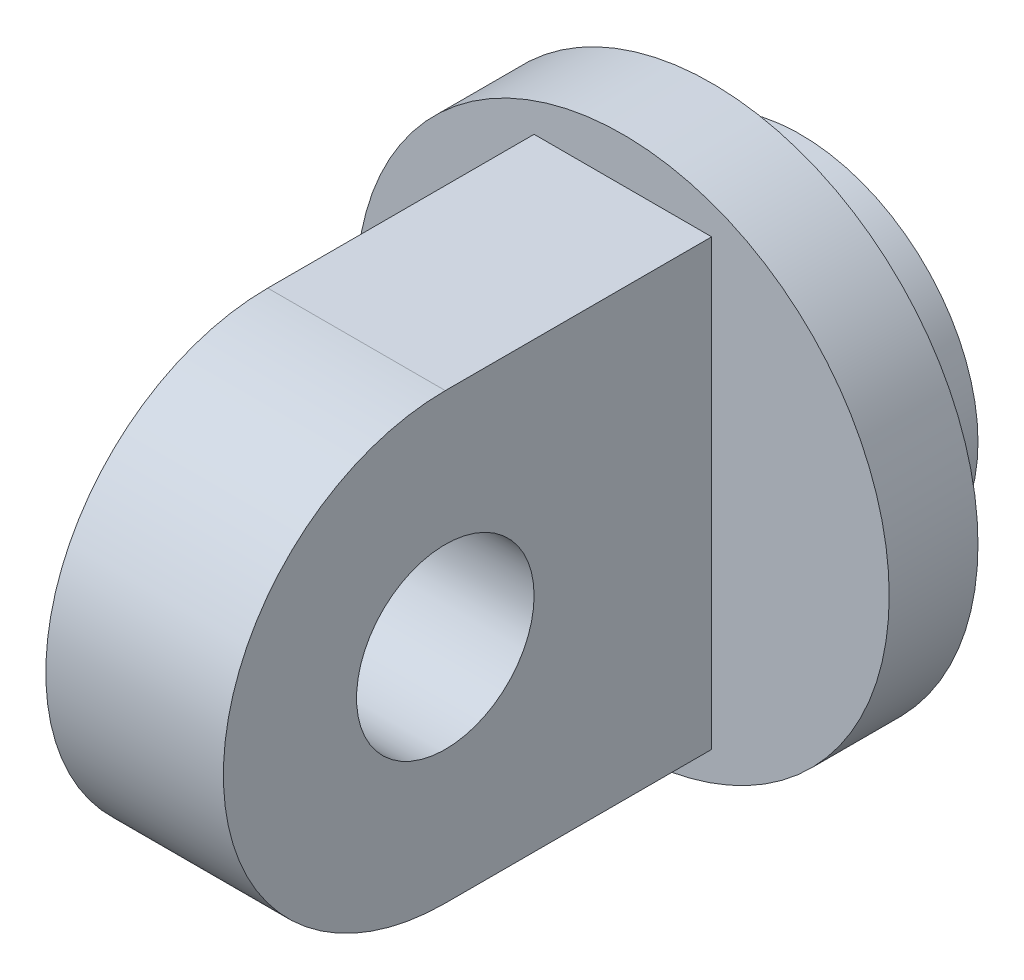
ISO-10303-21;
HEADER;
FILE_DESCRIPTION(('STEP AP214'),'2;1');
FILE_NAME('part.step','',(''),(''),'','','');
FILE_SCHEMA(('AUTOMOTIVE_DESIGN { 1 0 10303 214 1 1 1 1 }'));
ENDSEC;
DATA;
#1=APPLICATION_CONTEXT('core data for automotive mechanical design processes');
#2=APPLICATION_PROTOCOL_DEFINITION('international standard','automotive_design',2000,#1);
#3=PRODUCT_CONTEXT('',#1,'mechanical');
#4=PRODUCT('Part','Part','',(#3));
#5=PRODUCT_RELATED_PRODUCT_CATEGORY('part','',(#4));
#6=PRODUCT_DEFINITION_FORMATION('','',#4);
#7=PRODUCT_DEFINITION_CONTEXT('part definition',#1,'design');
#8=PRODUCT_DEFINITION('design','',#6,#7);
#9=PRODUCT_DEFINITION_SHAPE('','',#8);
#10=(LENGTH_UNIT() NAMED_UNIT(*) SI_UNIT(.MILLI.,.METRE.));
#11=(NAMED_UNIT(*) PLANE_ANGLE_UNIT() SI_UNIT($,.RADIAN.));
#12=(NAMED_UNIT(*) SI_UNIT($,.STERADIAN.) SOLID_ANGLE_UNIT());
#13=UNCERTAINTY_MEASURE_WITH_UNIT(LENGTH_MEASURE(1.E-05),#10,'distance_accuracy_value','');
#14=(GEOMETRIC_REPRESENTATION_CONTEXT(3) GLOBAL_UNCERTAINTY_ASSIGNED_CONTEXT((#13)) GLOBAL_UNIT_ASSIGNED_CONTEXT((#10,
#11,#12)) REPRESENTATION_CONTEXT('',''));
#15=CARTESIAN_POINT('',(0.,0.,0.));
#16=DIRECTION('',(0.,0.,1.));
#17=DIRECTION('',(1.,0.,0.));
#18=AXIS2_PLACEMENT_3D('',#15,#16,#17);
#19=CARTESIAN_POINT('',(0.,0.,500.));
#20=DIRECTION('',(0.,0.,1.));
#21=DIRECTION('',(1.,0.,0.));
#22=AXIS2_PLACEMENT_3D('',#19,#20,#21);
#23=PLANE('',#22);
#24=CARTESIAN_POINT('',(0.,0.,500.));
#25=DIRECTION('',(0.,0.,1.));
#26=DIRECTION('',(1.,0.,0.));
#27=AXIS2_PLACEMENT_3D('',#24,#25,#26);
#28=CIRCLE('',#27,750.);
#29=CARTESIAN_POINT('',(750.,0.,500.));
#30=VERTEX_POINT('',#29);
#31=EDGE_CURVE('E95',#30,#30,#28,.T.);
#32=ORIENTED_EDGE('',*,*,#31,.T.);
#33=EDGE_LOOP('',(#32));
#34=FACE_BOUND('',#33,.T.);
#35=DIRECTION('',(0.,1.,0.));
#36=VECTOR('',#35,1.);
#37=CARTESIAN_POINT('',(250.,625.,500.));
#38=LINE('',#37,#36);
#39=CARTESIAN_POINT('',(250.,-625.,500.));
#40=VERTEX_POINT('',#39);
#41=CARTESIAN_POINT('',(250.,625.,500.));
#42=VERTEX_POINT('',#41);
#43=EDGE_CURVE('E81',#40,#42,#38,.T.);
#44=ORIENTED_EDGE('',*,*,#43,.F.);
#45=DIRECTION('',(-1.,0.,0.));
#46=VECTOR('',#45,1.);
#47=CARTESIAN_POINT('',(250.,-625.,500.));
#48=LINE('',#47,#46);
#49=CARTESIAN_POINT('',(-250.,-625.,500.));
#50=VERTEX_POINT('',#49);
#51=EDGE_CURVE('E79',#40,#50,#48,.T.);
#52=ORIENTED_EDGE('',*,*,#51,.T.);
#53=DIRECTION('',(0.,1.,0.));
#54=VECTOR('',#53,1.);
#55=CARTESIAN_POINT('',(-250.,625.,500.));
#56=LINE('',#55,#54);
#57=CARTESIAN_POINT('',(-250.,625.,500.));
#58=VERTEX_POINT('',#57);
#59=EDGE_CURVE('E244',#50,#58,#56,.T.);
#60=ORIENTED_EDGE('',*,*,#59,.T.);
#61=DIRECTION('',(-1.,0.,0.));
#62=VECTOR('',#61,1.);
#63=CARTESIAN_POINT('',(250.,625.,500.));
#64=LINE('',#63,#62);
#65=EDGE_CURVE('E97',#42,#58,#64,.T.);
#66=ORIENTED_EDGE('',*,*,#65,.F.);
#67=EDGE_LOOP('',(#44,#52,#60,#66));
#68=FACE_BOUND('',#67,.T.);
#69=ADVANCED_FACE('F31',(#34,#68),#23,.T.);
#70=CARTESIAN_POINT('',(0.,0.,250.));
#71=DIRECTION('',(0.,0.,-1.));
#72=DIRECTION('',(-1.,0.,0.));
#73=AXIS2_PLACEMENT_3D('',#70,#71,#72);
#74=CYLINDRICAL_SURFACE('',#73,500.);
#75=CARTESIAN_POINT('',(0.,0.,250.));
#76=DIRECTION('',(0.,0.,1.));
#77=DIRECTION('',(1.,0.,0.));
#78=AXIS2_PLACEMENT_3D('',#75,#76,#77);
#79=CIRCLE('',#78,500.);
#80=CARTESIAN_POINT('',(500.,0.,250.));
#81=VERTEX_POINT('',#80);
#82=EDGE_CURVE('E11',#81,#81,#79,.T.);
#83=ORIENTED_EDGE('',*,*,#82,.F.);
#84=EDGE_LOOP('',(#83));
#85=FACE_BOUND('',#84,.T.);
#86=CARTESIAN_POINT('',(0.,0.,0.));
#87=DIRECTION('',(0.,0.,1.));
#88=DIRECTION('',(1.,0.,0.));
#89=AXIS2_PLACEMENT_3D('',#86,#87,#88);
#90=CIRCLE('',#89,500.);
#91=CARTESIAN_POINT('',(500.,0.,0.));
#92=VERTEX_POINT('',#91);
#93=EDGE_CURVE('E35',#92,#92,#90,.T.);
#94=ORIENTED_EDGE('',*,*,#93,.T.);
#95=EDGE_LOOP('',(#94));
#96=FACE_BOUND('',#95,.T.);
#97=ADVANCED_FACE('F33',(#85,#96),#74,.T.);
#98=CARTESIAN_POINT('',(0.,0.,0.));
#99=DIRECTION('',(0.,0.,1.));
#100=DIRECTION('',(1.,0.,0.));
#101=AXIS2_PLACEMENT_3D('',#98,#99,#100);
#102=PLANE('',#101);
#103=CARTESIAN_POINT('',(0.,0.,0.));
#104=DIRECTION('',(0.,0.,-1.));
#105=DIRECTION('',(-1.,0.,0.));
#106=AXIS2_PLACEMENT_3D('',#103,#104,#105);
#107=CIRCLE('',#106,125.);
#108=CARTESIAN_POINT('',(-125.,0.,0.));
#109=VERTEX_POINT('',#108);
#110=EDGE_CURVE('E102',#109,#109,#107,.T.);
#111=ORIENTED_EDGE('',*,*,#110,.F.);
#112=EDGE_LOOP('',(#111));
#113=FACE_BOUND('',#112,.T.);
#114=ORIENTED_EDGE('',*,*,#93,.F.);
#115=EDGE_LOOP('',(#114));
#116=FACE_BOUND('',#115,.T.);
#117=ADVANCED_FACE('F112',(#113,#116),#102,.F.);
#118=CARTESIAN_POINT('',(0.,0.,100.));
#119=DIRECTION('',(0.,0.,-1.));
#120=DIRECTION('',(-1.,0.,0.));
#121=AXIS2_PLACEMENT_3D('',#118,#119,#120);
#122=CYLINDRICAL_SURFACE('',#121,125.);
#123=CARTESIAN_POINT('',(0.,0.,100.));
#124=DIRECTION('',(0.,0.,-1.));
#125=DIRECTION('',(-1.,0.,0.));
#126=AXIS2_PLACEMENT_3D('',#123,#124,#125);
#127=CIRCLE('',#126,125.);
#128=CARTESIAN_POINT('',(-125.,0.,100.));
#129=VERTEX_POINT('',#128);
#130=EDGE_CURVE('E104',#129,#129,#127,.T.);
#131=ORIENTED_EDGE('',*,*,#130,.F.);
#132=EDGE_LOOP('',(#131));
#133=FACE_BOUND('',#132,.T.);
#134=ORIENTED_EDGE('',*,*,#110,.T.);
#135=EDGE_LOOP('',(#134));
#136=FACE_BOUND('',#135,.T.);
#137=ADVANCED_FACE('F110',(#133,#136),#122,.F.);
#138=CARTESIAN_POINT('',(0.,0.,100.));
#139=DIRECTION('',(0.,0.,-1.));
#140=DIRECTION('',(-1.,0.,0.));
#141=AXIS2_PLACEMENT_3D('',#138,#139,#140);
#142=PLANE('',#141);
#143=ORIENTED_EDGE('',*,*,#130,.T.);
#144=EDGE_LOOP('',(#143));
#145=FACE_BOUND('',#144,.T.);
#146=ADVANCED_FACE('F130',(#145),#142,.T.);
#147=CARTESIAN_POINT('',(0.,0.,250.));
#148=DIRECTION('',(0.,0.,1.));
#149=DIRECTION('',(1.,0.,0.));
#150=AXIS2_PLACEMENT_3D('',#147,#148,#149);
#151=PLANE('',#150);
#152=CARTESIAN_POINT('',(0.,0.,250.));
#153=DIRECTION('',(0.,0.,1.));
#154=DIRECTION('',(1.,0.,0.));
#155=AXIS2_PLACEMENT_3D('',#152,#153,#154);
#156=CIRCLE('',#155,750.);
#157=CARTESIAN_POINT('',(750.,0.,250.));
#158=VERTEX_POINT('',#157);
#159=EDGE_CURVE('E92',#158,#158,#156,.T.);
#160=ORIENTED_EDGE('',*,*,#159,.F.);
#161=EDGE_LOOP('',(#160));
#162=FACE_BOUND('',#161,.T.);
#163=ORIENTED_EDGE('',*,*,#82,.T.);
#164=EDGE_LOOP('',(#163));
#165=FACE_BOUND('',#164,.T.);
#166=ADVANCED_FACE('F127',(#162,#165),#151,.F.);
#167=CARTESIAN_POINT('',(0.,0.,500.));
#168=DIRECTION('',(0.,0.,-1.));
#169=DIRECTION('',(-1.,0.,0.));
#170=AXIS2_PLACEMENT_3D('',#167,#168,#169);
#171=CYLINDRICAL_SURFACE('',#170,750.);
#172=ORIENTED_EDGE('',*,*,#31,.F.);
#173=EDGE_LOOP('',(#172));
#174=FACE_BOUND('',#173,.T.);
#175=ORIENTED_EDGE('',*,*,#159,.T.);
#176=EDGE_LOOP('',(#175));
#177=FACE_BOUND('',#176,.T.);
#178=ADVANCED_FACE('F129',(#174,#177),#171,.T.);
#179=CARTESIAN_POINT('',(250.,-1.11022302462516E-13,1250.));
#180=DIRECTION('',(1.,0.,0.));
#181=DIRECTION('',(0.,0.,-1.));
#182=AXIS2_PLACEMENT_3D('',#179,#180,#181);
#183=PLANE('',#182);
#184=CARTESIAN_POINT('',(250.,-1.11022302462516E-13,1250.));
#185=DIRECTION('',(1.,0.,0.));
#186=DIRECTION('',(0.,0.,-1.));
#187=AXIS2_PLACEMENT_3D('',#184,#185,#186);
#188=CIRCLE('',#187,625.);
#189=CARTESIAN_POINT('',(250.,625.,1250.));
#190=VERTEX_POINT('',#189);
#191=CARTESIAN_POINT('',(250.,-625.,1250.));
#192=VERTEX_POINT('',#191);
#193=EDGE_CURVE('E82',#190,#192,#188,.T.);
#194=ORIENTED_EDGE('',*,*,#193,.T.);
#195=DIRECTION('',(0.,0.,-1.));
#196=VECTOR('',#195,1.);
#197=CARTESIAN_POINT('',(250.,-625.,500.));
#198=LINE('',#197,#196);
#199=EDGE_CURVE('E73',#192,#40,#198,.T.);
#200=ORIENTED_EDGE('',*,*,#199,.T.);
#201=ORIENTED_EDGE('',*,*,#43,.T.);
#202=DIRECTION('',(0.,0.,1.));
#203=VECTOR('',#202,1.);
#204=CARTESIAN_POINT('',(250.,625.,1250.));
#205=LINE('',#204,#203);
#206=EDGE_CURVE('E46',#42,#190,#205,.T.);
#207=ORIENTED_EDGE('',*,*,#206,.T.);
#208=EDGE_LOOP('',(#194,#200,#201,#207));
#209=FACE_BOUND('',#208,.T.);
#210=CARTESIAN_POINT('',(250.,-1.11022302462516E-13,1250.));
#211=DIRECTION('',(1.,0.,0.));
#212=DIRECTION('',(0.,0.,-1.));
#213=AXIS2_PLACEMENT_3D('',#210,#211,#212);
#214=CIRCLE('',#213,250.);
#215=CARTESIAN_POINT('',(250.,-1.11022302462516E-13,1000.));
#216=VERTEX_POINT('',#215);
#217=EDGE_CURVE('E230',#216,#216,#214,.T.);
#218=ORIENTED_EDGE('',*,*,#217,.F.);
#219=EDGE_LOOP('',(#218));
#220=FACE_BOUND('',#219,.T.);
#221=ADVANCED_FACE('F85',(#209,#220),#183,.T.);
#222=CARTESIAN_POINT('',(-250.,-1.11022302462516E-13,1250.));
#223=DIRECTION('',(1.,0.,0.));
#224=DIRECTION('',(0.,0.,-1.));
#225=AXIS2_PLACEMENT_3D('',#222,#223,#224);
#226=PLANE('',#225);
#227=CARTESIAN_POINT('',(-250.,-1.11022302462516E-13,1250.));
#228=DIRECTION('',(1.,0.,0.));
#229=DIRECTION('',(0.,0.,-1.));
#230=AXIS2_PLACEMENT_3D('',#227,#228,#229);
#231=CIRCLE('',#230,625.);
#232=CARTESIAN_POINT('',(-250.,625.,1250.));
#233=VERTEX_POINT('',#232);
#234=CARTESIAN_POINT('',(-250.,-625.,1250.));
#235=VERTEX_POINT('',#234);
#236=EDGE_CURVE('E91',#233,#235,#231,.T.);
#237=ORIENTED_EDGE('',*,*,#236,.F.);
#238=DIRECTION('',(0.,0.,1.));
#239=VECTOR('',#238,1.);
#240=CARTESIAN_POINT('',(-250.,625.,1250.));
#241=LINE('',#240,#239);
#242=EDGE_CURVE('E67',#58,#233,#241,.T.);
#243=ORIENTED_EDGE('',*,*,#242,.F.);
#244=ORIENTED_EDGE('',*,*,#59,.F.);
#245=DIRECTION('',(0.,0.,-1.));
#246=VECTOR('',#245,1.);
#247=CARTESIAN_POINT('',(-250.,-625.,500.));
#248=LINE('',#247,#246);
#249=EDGE_CURVE('E242',#235,#50,#248,.T.);
#250=ORIENTED_EDGE('',*,*,#249,.F.);
#251=EDGE_LOOP('',(#237,#243,#244,#250));
#252=FACE_BOUND('',#251,.T.);
#253=CARTESIAN_POINT('',(-250.,-1.11022302462516E-13,1250.));
#254=DIRECTION('',(1.,0.,0.));
#255=DIRECTION('',(0.,0.,-1.));
#256=AXIS2_PLACEMENT_3D('',#253,#254,#255);
#257=CIRCLE('',#256,250.);
#258=CARTESIAN_POINT('',(-250.,-1.11022302462516E-13,1000.));
#259=VERTEX_POINT('',#258);
#260=EDGE_CURVE('E233',#259,#259,#257,.T.);
#261=ORIENTED_EDGE('',*,*,#260,.T.);
#262=EDGE_LOOP('',(#261));
#263=FACE_BOUND('',#262,.T.);
#264=ADVANCED_FACE('F180',(#252,#263),#226,.F.);
#265=CARTESIAN_POINT('',(250.,-1.11022302462516E-13,1250.));
#266=DIRECTION('',(-1.,0.,0.));
#267=DIRECTION('',(0.,0.,1.));
#268=AXIS2_PLACEMENT_3D('',#265,#266,#267);
#269=CYLINDRICAL_SURFACE('',#268,625.);
#270=ORIENTED_EDGE('',*,*,#236,.T.);
#271=DIRECTION('',(-1.,0.,0.));
#272=VECTOR('',#271,1.);
#273=CARTESIAN_POINT('',(250.,-625.,1250.));
#274=LINE('',#273,#272);
#275=EDGE_CURVE('E76',#192,#235,#274,.T.);
#276=ORIENTED_EDGE('',*,*,#275,.F.);
#277=ORIENTED_EDGE('',*,*,#193,.F.);
#278=DIRECTION('',(-1.,0.,0.));
#279=VECTOR('',#278,1.);
#280=CARTESIAN_POINT('',(250.,625.,1250.));
#281=LINE('',#280,#279);
#282=EDGE_CURVE('E240',#190,#233,#281,.T.);
#283=ORIENTED_EDGE('',*,*,#282,.T.);
#284=EDGE_LOOP('',(#270,#276,#277,#283));
#285=FACE_BOUND('',#284,.T.);
#286=ADVANCED_FACE('F89',(#285),#269,.T.);
#287=CARTESIAN_POINT('',(250.,-625.,500.));
#288=DIRECTION('',(0.,1.,0.));
#289=DIRECTION('',(0.,0.,1.));
#290=AXIS2_PLACEMENT_3D('',#287,#288,#289);
#291=PLANE('',#290);
#292=ORIENTED_EDGE('',*,*,#249,.T.);
#293=ORIENTED_EDGE('',*,*,#51,.F.);
#294=ORIENTED_EDGE('',*,*,#199,.F.);
#295=ORIENTED_EDGE('',*,*,#275,.T.);
#296=EDGE_LOOP('',(#292,#293,#294,#295));
#297=FACE_BOUND('',#296,.T.);
#298=ADVANCED_FACE('F74',(#297),#291,.F.);
#299=CARTESIAN_POINT('',(250.,625.,1250.));
#300=DIRECTION('',(0.,-1.,0.));
#301=DIRECTION('',(0.,0.,-1.));
#302=AXIS2_PLACEMENT_3D('',#299,#300,#301);
#303=PLANE('',#302);
#304=ORIENTED_EDGE('',*,*,#242,.T.);
#305=ORIENTED_EDGE('',*,*,#282,.F.);
#306=ORIENTED_EDGE('',*,*,#206,.F.);
#307=ORIENTED_EDGE('',*,*,#65,.T.);
#308=EDGE_LOOP('',(#304,#305,#306,#307));
#309=FACE_BOUND('',#308,.T.);
#310=ADVANCED_FACE('F205',(#309),#303,.F.);
#311=CARTESIAN_POINT('',(250.,-1.11022302462516E-13,1250.));
#312=DIRECTION('',(-1.,0.,0.));
#313=DIRECTION('',(0.,0.,1.));
#314=AXIS2_PLACEMENT_3D('',#311,#312,#313);
#315=CYLINDRICAL_SURFACE('',#314,250.);
#316=ORIENTED_EDGE('',*,*,#217,.T.);
#317=EDGE_LOOP('',(#316));
#318=FACE_BOUND('',#317,.T.);
#319=ORIENTED_EDGE('',*,*,#260,.F.);
#320=EDGE_LOOP('',(#319));
#321=FACE_BOUND('',#320,.T.);
#322=ADVANCED_FACE('F214',(#318,#321),#315,.F.);
#323=CLOSED_SHELL('',(#69,#97,#117,#137,#146,#166,#178,#221,#264,#286,#298,#310,#322));
#324=MANIFOLD_SOLID_BREP('B2',#323);
#325=ADVANCED_BREP_SHAPE_REPRESENTATION('',(#18,#324),#14);
#326=SHAPE_DEFINITION_REPRESENTATION(#9,#325);
ENDSEC;
END-ISO-10303-21;
